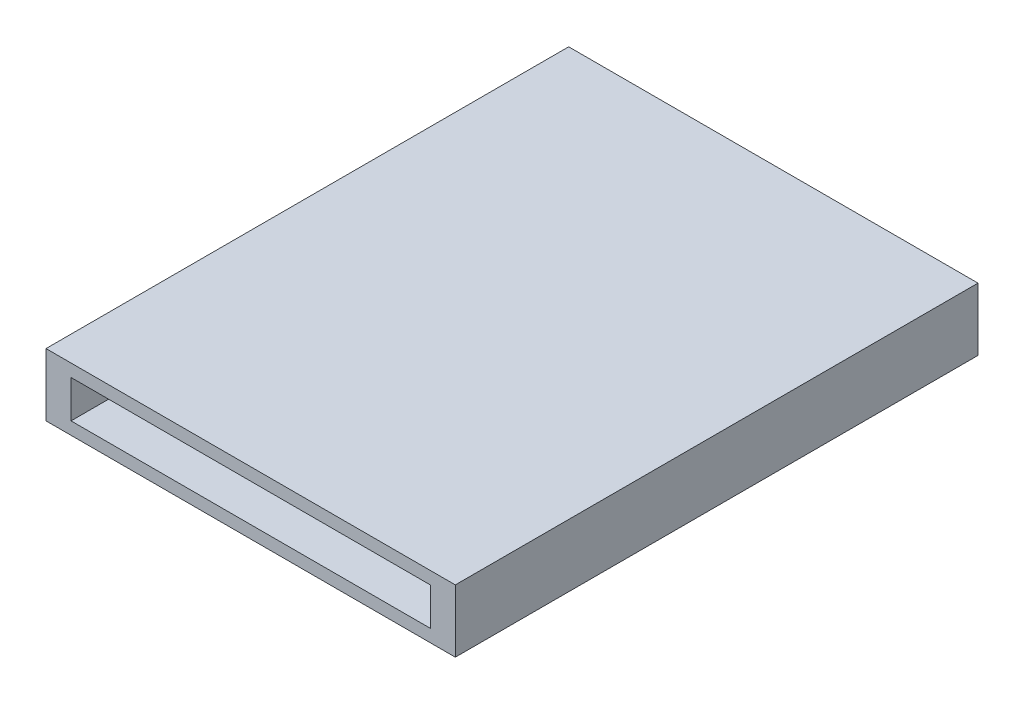
ISO-10303-21;
HEADER;
FILE_DESCRIPTION(('STEP AP214'),'2;1');
FILE_NAME('part.step','',(''),(''),'','','');
FILE_SCHEMA(('AUTOMOTIVE_DESIGN { 1 0 10303 214 1 1 1 1 }'));
ENDSEC;
DATA;
#1=APPLICATION_CONTEXT('core data for automotive mechanical design processes');
#2=APPLICATION_PROTOCOL_DEFINITION('international standard','automotive_design',2000,#1);
#3=PRODUCT_CONTEXT('',#1,'mechanical');
#4=PRODUCT('Part','Part','',(#3));
#5=PRODUCT_RELATED_PRODUCT_CATEGORY('part','',(#4));
#6=PRODUCT_DEFINITION_FORMATION('','',#4);
#7=PRODUCT_DEFINITION_CONTEXT('part definition',#1,'design');
#8=PRODUCT_DEFINITION('design','',#6,#7);
#9=PRODUCT_DEFINITION_SHAPE('','',#8);
#10=(LENGTH_UNIT() NAMED_UNIT(*) SI_UNIT(.MILLI.,.METRE.));
#11=(NAMED_UNIT(*) PLANE_ANGLE_UNIT() SI_UNIT($,.RADIAN.));
#12=(NAMED_UNIT(*) SI_UNIT($,.STERADIAN.) SOLID_ANGLE_UNIT());
#13=UNCERTAINTY_MEASURE_WITH_UNIT(LENGTH_MEASURE(1.E-05),#10,'distance_accuracy_value','');
#14=(GEOMETRIC_REPRESENTATION_CONTEXT(3) GLOBAL_UNCERTAINTY_ASSIGNED_CONTEXT((#13)) GLOBAL_UNIT_ASSIGNED_CONTEXT((#10,
#11,#12)) REPRESENTATION_CONTEXT('',''));
#15=CARTESIAN_POINT('',(0.,0.,0.));
#16=DIRECTION('',(0.,0.,1.));
#17=DIRECTION('',(1.,0.,0.));
#18=AXIS2_PLACEMENT_3D('',#15,#16,#17);
#19=CARTESIAN_POINT('',(-56.8223132529481,2.5,-9.42520372526193));
#20=DIRECTION('',(0.,0.,-1.));
#21=DIRECTION('',(-1.,0.,0.));
#22=AXIS2_PLACEMENT_3D('',#19,#20,#21);
#23=PLANE('',#22);
#24=DIRECTION('',(1.,0.,0.));
#25=VECTOR('',#24,1.);
#26=CARTESIAN_POINT('',(-56.8223132529481,0.,-9.42520372526193));
#27=LINE('',#26,#25);
#28=CARTESIAN_POINT('',(-56.8223132529481,0.,-9.42520372526193));
#29=VERTEX_POINT('',#28);
#30=CARTESIAN_POINT('',(-40.4852934624941,0.,-9.42520372526193));
#31=VERTEX_POINT('',#30);
#32=EDGE_CURVE('E162',#29,#31,#27,.T.);
#33=ORIENTED_EDGE('',*,*,#32,.T.);
#34=DIRECTION('',(0.,-1.,0.));
#35=VECTOR('',#34,1.);
#36=CARTESIAN_POINT('',(-40.4852934624941,2.5,-9.42520372526193));
#37=LINE('',#36,#35);
#38=CARTESIAN_POINT('',(-40.4852934624941,2.5,-9.42520372526193));
#39=VERTEX_POINT('',#38);
#40=EDGE_CURVE('E169',#39,#31,#37,.T.);
#41=ORIENTED_EDGE('',*,*,#40,.F.);
#42=DIRECTION('',(1.,0.,0.));
#43=VECTOR('',#42,1.);
#44=CARTESIAN_POINT('',(-56.8223132529481,2.5,-9.42520372526193));
#45=LINE('',#44,#43);
#46=CARTESIAN_POINT('',(-56.8223132529481,2.5,-9.42520372526193));
#47=VERTEX_POINT('',#46);
#48=EDGE_CURVE('E154',#47,#39,#45,.T.);
#49=ORIENTED_EDGE('',*,*,#48,.F.);
#50=DIRECTION('',(0.,-1.,0.));
#51=VECTOR('',#50,1.);
#52=CARTESIAN_POINT('',(-56.8223132529481,2.5,-9.42520372526193));
#53=LINE('',#52,#51);
#54=EDGE_CURVE('E48',#47,#29,#53,.T.);
#55=ORIENTED_EDGE('',*,*,#54,.T.);
#56=EDGE_LOOP('',(#33,#41,#49,#55));
#57=FACE_BOUND('',#56,.T.);
#58=DIRECTION('',(1.,0.,0.));
#59=VECTOR('',#58,1.);
#60=CARTESIAN_POINT('',(-55.8223132529481,2.,-9.42520372526193));
#61=LINE('',#60,#59);
#62=CARTESIAN_POINT('',(-55.8223132529481,2.,-9.42520372526193));
#63=VERTEX_POINT('',#62);
#64=CARTESIAN_POINT('',(-41.4852934624941,2.,-9.42520372526193));
#65=VERTEX_POINT('',#64);
#66=EDGE_CURVE('E55',#63,#65,#61,.T.);
#67=ORIENTED_EDGE('',*,*,#66,.T.);
#68=DIRECTION('',(0.,-1.,0.));
#69=VECTOR('',#68,1.);
#70=CARTESIAN_POINT('',(-41.4852934624941,2.,-9.42520372526193));
#71=LINE('',#70,#69);
#72=CARTESIAN_POINT('',(-41.4852934624941,0.5,-9.42520372526193));
#73=VERTEX_POINT('',#72);
#74=EDGE_CURVE('E135',#65,#73,#71,.T.);
#75=ORIENTED_EDGE('',*,*,#74,.T.);
#76=DIRECTION('',(-1.,0.,0.));
#77=VECTOR('',#76,1.);
#78=CARTESIAN_POINT('',(-41.4852934624941,0.5,-9.42520372526193));
#79=LINE('',#78,#77);
#80=CARTESIAN_POINT('',(-55.8223132529481,0.5,-9.42520372526193));
#81=VERTEX_POINT('',#80);
#82=EDGE_CURVE('E280',#73,#81,#79,.T.);
#83=ORIENTED_EDGE('',*,*,#82,.T.);
#84=DIRECTION('',(0.,1.,0.));
#85=VECTOR('',#84,1.);
#86=CARTESIAN_POINT('',(-55.8223132529481,0.5,-9.42520372526193));
#87=LINE('',#86,#85);
#88=EDGE_CURVE('E131',#81,#63,#87,.T.);
#89=ORIENTED_EDGE('',*,*,#88,.T.);
#90=EDGE_LOOP('',(#67,#75,#83,#89));
#91=FACE_BOUND('',#90,.T.);
#92=ADVANCED_FACE('F39',(#57,#91),#23,.F.);
#93=CARTESIAN_POINT('',(-40.4852934624941,2.5,-30.2863213038417));
#94=DIRECTION('',(0.,0.,1.));
#95=DIRECTION('',(1.,0.,0.));
#96=AXIS2_PLACEMENT_3D('',#93,#94,#95);
#97=PLANE('',#96);
#98=DIRECTION('',(-1.,0.,0.));
#99=VECTOR('',#98,1.);
#100=CARTESIAN_POINT('',(-40.4852934624941,0.,-30.2863213038417));
#101=LINE('',#100,#99);
#102=CARTESIAN_POINT('',(-40.4852934624941,0.,-30.2863213038417));
#103=VERTEX_POINT('',#102);
#104=CARTESIAN_POINT('',(-56.8223132529481,0.,-30.2863213038417));
#105=VERTEX_POINT('',#104);
#106=EDGE_CURVE('E137',#103,#105,#101,.T.);
#107=ORIENTED_EDGE('',*,*,#106,.T.);
#108=DIRECTION('',(0.,-1.,0.));
#109=VECTOR('',#108,1.);
#110=CARTESIAN_POINT('',(-56.8223132529481,2.5,-30.2863213038417));
#111=LINE('',#110,#109);
#112=CARTESIAN_POINT('',(-56.8223132529481,2.5,-30.2863213038417));
#113=VERTEX_POINT('',#112);
#114=EDGE_CURVE('E11',#113,#105,#111,.T.);
#115=ORIENTED_EDGE('',*,*,#114,.F.);
#116=DIRECTION('',(-1.,0.,0.));
#117=VECTOR('',#116,1.);
#118=CARTESIAN_POINT('',(-40.4852934624941,2.5,-30.2863213038417));
#119=LINE('',#118,#117);
#120=CARTESIAN_POINT('',(-40.4852934624941,2.5,-30.2863213038417));
#121=VERTEX_POINT('',#120);
#122=EDGE_CURVE('E149',#121,#113,#119,.T.);
#123=ORIENTED_EDGE('',*,*,#122,.F.);
#124=DIRECTION('',(0.,-1.,0.));
#125=VECTOR('',#124,1.);
#126=CARTESIAN_POINT('',(-40.4852934624941,2.5,-30.2863213038417));
#127=LINE('',#126,#125);
#128=EDGE_CURVE('E158',#121,#103,#127,.T.);
#129=ORIENTED_EDGE('',*,*,#128,.T.);
#130=EDGE_LOOP('',(#107,#115,#123,#129));
#131=FACE_BOUND('',#130,.T.);
#132=ADVANCED_FACE('F41',(#131),#97,.F.);
#133=CARTESIAN_POINT('',(-56.8223132529481,2.5,-30.2863213038417));
#134=DIRECTION('',(1.,0.,0.));
#135=DIRECTION('',(0.,0.,-1.));
#136=AXIS2_PLACEMENT_3D('',#133,#134,#135);
#137=PLANE('',#136);
#138=DIRECTION('',(0.,0.,1.));
#139=VECTOR('',#138,1.);
#140=CARTESIAN_POINT('',(-56.8223132529481,0.,-30.2863213038417));
#141=LINE('',#140,#139);
#142=EDGE_CURVE('E143',#105,#29,#141,.T.);
#143=ORIENTED_EDGE('',*,*,#142,.T.);
#144=ORIENTED_EDGE('',*,*,#54,.F.);
#145=DIRECTION('',(0.,0.,1.));
#146=VECTOR('',#145,1.);
#147=CARTESIAN_POINT('',(-56.8223132529481,2.5,-30.2863213038417));
#148=LINE('',#147,#146);
#149=EDGE_CURVE('E92',#113,#47,#148,.T.);
#150=ORIENTED_EDGE('',*,*,#149,.F.);
#151=ORIENTED_EDGE('',*,*,#114,.T.);
#152=EDGE_LOOP('',(#143,#144,#150,#151));
#153=FACE_BOUND('',#152,.T.);
#154=ADVANCED_FACE('F187',(#153),#137,.F.);
#155=CARTESIAN_POINT('',(-40.4852934624941,2.5,-9.42520372526193));
#156=DIRECTION('',(-1.,0.,0.));
#157=DIRECTION('',(0.,0.,1.));
#158=AXIS2_PLACEMENT_3D('',#155,#156,#157);
#159=PLANE('',#158);
#160=DIRECTION('',(0.,0.,-1.));
#161=VECTOR('',#160,1.);
#162=CARTESIAN_POINT('',(-40.4852934624941,0.,-9.42520372526193));
#163=LINE('',#162,#161);
#164=EDGE_CURVE('E85',#31,#103,#163,.T.);
#165=ORIENTED_EDGE('',*,*,#164,.T.);
#166=ORIENTED_EDGE('',*,*,#128,.F.);
#167=DIRECTION('',(0.,0.,-1.));
#168=VECTOR('',#167,1.);
#169=CARTESIAN_POINT('',(-40.4852934624941,2.5,-9.42520372526193));
#170=LINE('',#169,#168);
#171=EDGE_CURVE('E64',#39,#121,#170,.T.);
#172=ORIENTED_EDGE('',*,*,#171,.F.);
#173=ORIENTED_EDGE('',*,*,#40,.T.);
#174=EDGE_LOOP('',(#165,#166,#172,#173));
#175=FACE_BOUND('',#174,.T.);
#176=ADVANCED_FACE('F184',(#175),#159,.F.);
#177=CARTESIAN_POINT('',(0.,2.5,0.));
#178=DIRECTION('',(0.,1.,0.));
#179=DIRECTION('',(0.,0.,1.));
#180=AXIS2_PLACEMENT_3D('',#177,#178,#179);
#181=PLANE('',#180);
#182=ORIENTED_EDGE('',*,*,#122,.T.);
#183=ORIENTED_EDGE('',*,*,#149,.T.);
#184=ORIENTED_EDGE('',*,*,#48,.T.);
#185=ORIENTED_EDGE('',*,*,#171,.T.);
#186=EDGE_LOOP('',(#182,#183,#184,#185));
#187=FACE_BOUND('',#186,.T.);
#188=ADVANCED_FACE('F186',(#187),#181,.T.);
#189=CARTESIAN_POINT('',(0.,0.,0.));
#190=DIRECTION('',(0.,1.,0.));
#191=DIRECTION('',(0.,0.,1.));
#192=AXIS2_PLACEMENT_3D('',#189,#190,#191);
#193=PLANE('',#192);
#194=ORIENTED_EDGE('',*,*,#106,.F.);
#195=ORIENTED_EDGE('',*,*,#164,.F.);
#196=ORIENTED_EDGE('',*,*,#32,.F.);
#197=ORIENTED_EDGE('',*,*,#142,.F.);
#198=EDGE_LOOP('',(#194,#195,#196,#197));
#199=FACE_BOUND('',#198,.T.);
#200=ADVANCED_FACE('F180',(#199),#193,.F.);
#201=CARTESIAN_POINT('',(-55.8223132529481,2.,-30.1252037252619));
#202=DIRECTION('',(0.,-1.,0.));
#203=DIRECTION('',(0.,0.,-1.));
#204=AXIS2_PLACEMENT_3D('',#201,#202,#203);
#205=PLANE('',#204);
#206=ORIENTED_EDGE('',*,*,#66,.F.);
#207=DIRECTION('',(0.,0.,1.));
#208=VECTOR('',#207,1.);
#209=CARTESIAN_POINT('',(-55.8223132529481,2.,-30.1252037252619));
#210=LINE('',#209,#208);
#211=CARTESIAN_POINT('',(-55.8223132529481,2.,-30.1252037252619));
#212=VERTEX_POINT('',#211);
#213=EDGE_CURVE('E129',#212,#63,#210,.T.);
#214=ORIENTED_EDGE('',*,*,#213,.F.);
#215=DIRECTION('',(1.,0.,0.));
#216=VECTOR('',#215,1.);
#217=CARTESIAN_POINT('',(-55.8223132529481,2.,-30.1252037252619));
#218=LINE('',#217,#216);
#219=CARTESIAN_POINT('',(-41.4852934624941,2.,-30.1252037252619));
#220=VERTEX_POINT('',#219);
#221=EDGE_CURVE('E120',#212,#220,#218,.T.);
#222=ORIENTED_EDGE('',*,*,#221,.T.);
#223=DIRECTION('',(0.,0.,1.));
#224=VECTOR('',#223,1.);
#225=CARTESIAN_POINT('',(-41.4852934624941,2.,-30.1252037252619));
#226=LINE('',#225,#224);
#227=EDGE_CURVE('E128',#220,#65,#226,.T.);
#228=ORIENTED_EDGE('',*,*,#227,.T.);
#229=EDGE_LOOP('',(#206,#214,#222,#228));
#230=FACE_BOUND('',#229,.T.);
#231=ADVANCED_FACE('F127',(#230),#205,.T.);
#232=CARTESIAN_POINT('',(-41.4852934624941,2.,-30.1252037252619));
#233=DIRECTION('',(-1.,0.,0.));
#234=DIRECTION('',(0.,0.,1.));
#235=AXIS2_PLACEMENT_3D('',#232,#233,#234);
#236=PLANE('',#235);
#237=ORIENTED_EDGE('',*,*,#74,.F.);
#238=ORIENTED_EDGE('',*,*,#227,.F.);
#239=DIRECTION('',(0.,-1.,0.));
#240=VECTOR('',#239,1.);
#241=CARTESIAN_POINT('',(-41.4852934624941,2.,-30.1252037252619));
#242=LINE('',#241,#240);
#243=CARTESIAN_POINT('',(-41.4852934624941,0.5,-30.1252037252619));
#244=VERTEX_POINT('',#243);
#245=EDGE_CURVE('E116',#220,#244,#242,.T.);
#246=ORIENTED_EDGE('',*,*,#245,.T.);
#247=DIRECTION('',(0.,0.,1.));
#248=VECTOR('',#247,1.);
#249=CARTESIAN_POINT('',(-41.4852934624941,0.5,-30.1252037252619));
#250=LINE('',#249,#248);
#251=EDGE_CURVE('E138',#244,#73,#250,.T.);
#252=ORIENTED_EDGE('',*,*,#251,.T.);
#253=EDGE_LOOP('',(#237,#238,#246,#252));
#254=FACE_BOUND('',#253,.T.);
#255=ADVANCED_FACE('F133',(#254),#236,.T.);
#256=CARTESIAN_POINT('',(-41.4852934624941,0.5,-30.1252037252619));
#257=DIRECTION('',(0.,1.,0.));
#258=DIRECTION('',(0.,0.,1.));
#259=AXIS2_PLACEMENT_3D('',#256,#257,#258);
#260=PLANE('',#259);
#261=ORIENTED_EDGE('',*,*,#82,.F.);
#262=ORIENTED_EDGE('',*,*,#251,.F.);
#263=DIRECTION('',(-1.,0.,0.));
#264=VECTOR('',#263,1.);
#265=CARTESIAN_POINT('',(-41.4852934624941,0.5,-30.1252037252619));
#266=LINE('',#265,#264);
#267=CARTESIAN_POINT('',(-55.8223132529481,0.5,-30.1252037252619));
#268=VERTEX_POINT('',#267);
#269=EDGE_CURVE('E121',#244,#268,#266,.T.);
#270=ORIENTED_EDGE('',*,*,#269,.T.);
#271=DIRECTION('',(0.,0.,1.));
#272=VECTOR('',#271,1.);
#273=CARTESIAN_POINT('',(-55.8223132529481,0.5,-30.1252037252619));
#274=LINE('',#273,#272);
#275=EDGE_CURVE('E145',#268,#81,#274,.T.);
#276=ORIENTED_EDGE('',*,*,#275,.T.);
#277=EDGE_LOOP('',(#261,#262,#270,#276));
#278=FACE_BOUND('',#277,.T.);
#279=ADVANCED_FACE('F244',(#278),#260,.T.);
#280=CARTESIAN_POINT('',(-55.8223132529481,0.5,-30.1252037252619));
#281=DIRECTION('',(1.,0.,0.));
#282=DIRECTION('',(0.,0.,-1.));
#283=AXIS2_PLACEMENT_3D('',#280,#281,#282);
#284=PLANE('',#283);
#285=ORIENTED_EDGE('',*,*,#88,.F.);
#286=ORIENTED_EDGE('',*,*,#275,.F.);
#287=DIRECTION('',(0.,1.,0.));
#288=VECTOR('',#287,1.);
#289=CARTESIAN_POINT('',(-55.8223132529481,0.5,-30.1252037252619));
#290=LINE('',#289,#288);
#291=EDGE_CURVE('E290',#268,#212,#290,.T.);
#292=ORIENTED_EDGE('',*,*,#291,.T.);
#293=ORIENTED_EDGE('',*,*,#213,.T.);
#294=EDGE_LOOP('',(#285,#286,#292,#293));
#295=FACE_BOUND('',#294,.T.);
#296=ADVANCED_FACE('F253',(#295),#284,.T.);
#297=CARTESIAN_POINT('',(0.,0.,-30.1252037252619));
#298=DIRECTION('',(0.,0.,-1.));
#299=DIRECTION('',(-1.,0.,0.));
#300=AXIS2_PLACEMENT_3D('',#297,#298,#299);
#301=PLANE('',#300);
#302=ORIENTED_EDGE('',*,*,#221,.F.);
#303=ORIENTED_EDGE('',*,*,#291,.F.);
#304=ORIENTED_EDGE('',*,*,#269,.F.);
#305=ORIENTED_EDGE('',*,*,#245,.F.);
#306=EDGE_LOOP('',(#302,#303,#304,#305));
#307=FACE_BOUND('',#306,.T.);
#308=ADVANCED_FACE('F118',(#307),#301,.F.);
#309=CLOSED_SHELL('',(#92,#132,#154,#176,#188,#200,#231,#255,#279,#296,#308));
#310=MANIFOLD_SOLID_BREP('B2',#309);
#311=ADVANCED_BREP_SHAPE_REPRESENTATION('',(#18,#310),#14);
#312=SHAPE_DEFINITION_REPRESENTATION(#9,#311);
ENDSEC;
END-ISO-10303-21;
